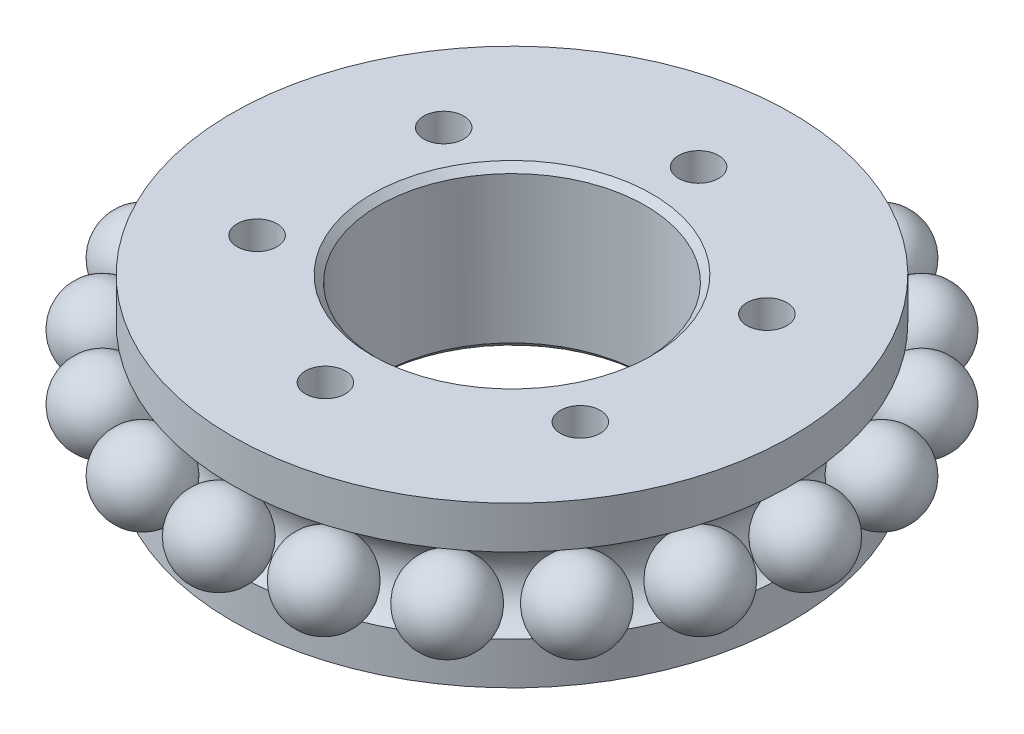
ISO-10303-21;
HEADER;
FILE_DESCRIPTION(('STEP AP214'),'2;1');
FILE_NAME('part.step','',(''),(''),'','','');
FILE_SCHEMA(('AUTOMOTIVE_DESIGN { 1 0 10303 214 1 1 1 1 }'));
ENDSEC;
DATA;
#1=APPLICATION_CONTEXT('core data for automotive mechanical design processes');
#2=APPLICATION_PROTOCOL_DEFINITION('international standard','automotive_design',2000,#1);
#3=PRODUCT_CONTEXT('',#1,'mechanical');
#4=PRODUCT('Part','Part','',(#3));
#5=PRODUCT_RELATED_PRODUCT_CATEGORY('part','',(#4));
#6=PRODUCT_DEFINITION_FORMATION('','',#4);
#7=PRODUCT_DEFINITION_CONTEXT('part definition',#1,'design');
#8=PRODUCT_DEFINITION('design','',#6,#7);
#9=PRODUCT_DEFINITION_SHAPE('','',#8);
#10=(LENGTH_UNIT() NAMED_UNIT(*) SI_UNIT(.MILLI.,.METRE.));
#11=(NAMED_UNIT(*) PLANE_ANGLE_UNIT() SI_UNIT($,.RADIAN.));
#12=(NAMED_UNIT(*) SI_UNIT($,.STERADIAN.) SOLID_ANGLE_UNIT());
#13=UNCERTAINTY_MEASURE_WITH_UNIT(LENGTH_MEASURE(1.E-05),#10,'distance_accuracy_value','');
#14=(GEOMETRIC_REPRESENTATION_CONTEXT(3) GLOBAL_UNCERTAINTY_ASSIGNED_CONTEXT((#13)) GLOBAL_UNIT_ASSIGNED_CONTEXT((#10,
#11,#12)) REPRESENTATION_CONTEXT('',''));
#15=CARTESIAN_POINT('',(0.,0.,0.));
#16=DIRECTION('',(0.,0.,1.));
#17=DIRECTION('',(1.,0.,0.));
#18=AXIS2_PLACEMENT_3D('',#15,#16,#17);
#19=CARTESIAN_POINT('',(-6.79837387624859,0.,20.9232433584935));
#20=DIRECTION('',(0.,1.,0.));
#21=DIRECTION('',(0.309016994374936,0.,-0.951056516295158));
#22=AXIS2_PLACEMENT_3D('',#19,#20,#21);
#23=SPHERICAL_SURFACE('',#22,3.);
#24=CARTESIAN_POINT('',(-6.79837387624859,3.,20.9232433584935));
#25=VERTEX_POINT('',#24);
#26=VERTEX_LOOP('',#25);
#27=FACE_BOUND('',#26,.T.);
#28=ADVANCED_FACE('F39',(#27),#23,.T.);
#29=CLOSED_SHELL('',(#28));
#30=MANIFOLD_SOLID_BREP('B2',#29);
#31=CARTESIAN_POINT('',(-12.9312755504342,0.,17.798373876249));
#32=DIRECTION('',(0.,1.,0.));
#33=DIRECTION('',(0.587785252292463,0.,-0.809016994374955));
#34=AXIS2_PLACEMENT_3D('',#31,#32,#33);
#35=SPHERICAL_SURFACE('',#34,3.);
#36=CARTESIAN_POINT('',(-12.9312755504342,3.,17.798373876249));
#37=VERTEX_POINT('',#36);
#38=VERTEX_LOOP('',#37);
#39=FACE_BOUND('',#38,.T.);
#40=ADVANCED_FACE('F59',(#39),#35,.T.);
#41=CLOSED_SHELL('',(#40));
#42=MANIFOLD_SOLID_BREP('B6',#41);
#43=CARTESIAN_POINT('',(-17.7983738762487,0.,12.9312755504346));
#44=DIRECTION('',(0.,1.,0.));
#45=DIRECTION('',(0.809016994374941,0.,-0.587785252292482));
#46=AXIS2_PLACEMENT_3D('',#43,#44,#45);
#47=SPHERICAL_SURFACE('',#46,3.);
#48=CARTESIAN_POINT('',(-17.7983738762487,3.,12.9312755504346));
#49=VERTEX_POINT('',#48);
#50=VERTEX_LOOP('',#49);
#51=FACE_BOUND('',#50,.T.);
#52=ADVANCED_FACE('F79',(#51),#47,.T.);
#53=CLOSED_SHELL('',(#52));
#54=MANIFOLD_SOLID_BREP('B35',#53);
#55=CARTESIAN_POINT('',(-20.9232433584933,0.,6.79837387624906));
#56=DIRECTION('',(0.,1.,0.));
#57=DIRECTION('',(0.95105651629515,0.,-0.309016994374957));
#58=AXIS2_PLACEMENT_3D('',#55,#56,#57);
#59=SPHERICAL_SURFACE('',#58,3.);
#60=CARTESIAN_POINT('',(-20.9232433584933,3.,6.79837387624906));
#61=VERTEX_POINT('',#60);
#62=VERTEX_LOOP('',#61);
#63=FACE_BOUND('',#62,.T.);
#64=ADVANCED_FACE('F99',(#63),#59,.T.);
#65=CLOSED_SHELL('',(#64));
#66=MANIFOLD_SOLID_BREP('B55',#65);
#67=CARTESIAN_POINT('',(-22.,0.,2.10897843130244E-13));
#68=DIRECTION('',(0.,1.,0.));
#69=DIRECTION('',(1.,0.,0.));
#70=AXIS2_PLACEMENT_3D('',#67,#68,#69);
#71=SPHERICAL_SURFACE('',#70,3.);
#72=CARTESIAN_POINT('',(-22.,3.,2.10897843130244E-13));
#73=VERTEX_POINT('',#72);
#74=VERTEX_LOOP('',#73);
#75=FACE_BOUND('',#74,.T.);
#76=ADVANCED_FACE('F119',(#75),#71,.T.);
#77=CLOSED_SHELL('',(#76));
#78=MANIFOLD_SOLID_BREP('B75',#77);
#79=CARTESIAN_POINT('',(-20.9232433584934,0.,-6.79837387624866));
#80=DIRECTION('',(0.,1.,0.));
#81=DIRECTION('',(0.951056516295156,0.,0.309016994374939));
#82=AXIS2_PLACEMENT_3D('',#79,#80,#81);
#83=SPHERICAL_SURFACE('',#82,3.);
#84=CARTESIAN_POINT('',(-20.9232433584934,3.,-6.79837387624866));
#85=VERTEX_POINT('',#84);
#86=VERTEX_LOOP('',#85);
#87=FACE_BOUND('',#86,.T.);
#88=ADVANCED_FACE('F139',(#87),#83,.T.);
#89=CLOSED_SHELL('',(#88));
#90=MANIFOLD_SOLID_BREP('B95',#89);
#91=CARTESIAN_POINT('',(-17.798373876249,0.,-12.9312755504343));
#92=DIRECTION('',(0.,1.,0.));
#93=DIRECTION('',(0.809016994374953,0.,0.587785252292466));
#94=AXIS2_PLACEMENT_3D('',#91,#92,#93);
#95=SPHERICAL_SURFACE('',#94,3.);
#96=CARTESIAN_POINT('',(-17.798373876249,3.,-12.9312755504343));
#97=VERTEX_POINT('',#96);
#98=VERTEX_LOOP('',#97);
#99=FACE_BOUND('',#98,.T.);
#100=ADVANCED_FACE('F159',(#99),#95,.T.);
#101=CLOSED_SHELL('',(#100));
#102=MANIFOLD_SOLID_BREP('B115',#101);
#103=CARTESIAN_POINT('',(-12.9312755504345,0.,-17.7983738762487));
#104=DIRECTION('',(0.,1.,0.));
#105=DIRECTION('',(0.58778525229248,0.,0.809016994374943));
#106=AXIS2_PLACEMENT_3D('',#103,#104,#105);
#107=SPHERICAL_SURFACE('',#106,3.);
#108=CARTESIAN_POINT('',(-12.9312755504345,3.,-17.7983738762487));
#109=VERTEX_POINT('',#108);
#110=VERTEX_LOOP('',#109);
#111=FACE_BOUND('',#110,.T.);
#112=ADVANCED_FACE('F179',(#111),#107,.T.);
#113=CLOSED_SHELL('',(#112));
#114=MANIFOLD_SOLID_BREP('B135',#113);
#115=CARTESIAN_POINT('',(-6.79837387624899,0.,-20.9232433584933));
#116=DIRECTION('',(0.,1.,0.));
#117=DIRECTION('',(0.309016994374954,0.,0.951056516295151));
#118=AXIS2_PLACEMENT_3D('',#115,#116,#117);
#119=SPHERICAL_SURFACE('',#118,3.);
#120=CARTESIAN_POINT('',(-6.79837387624899,3.,-20.9232433584933));
#121=VERTEX_POINT('',#120);
#122=VERTEX_LOOP('',#121);
#123=FACE_BOUND('',#122,.T.);
#124=ADVANCED_FACE('F199',(#123),#119,.T.);
#125=CLOSED_SHELL('',(#124));
#126=MANIFOLD_SOLID_BREP('B155',#125);
#127=CARTESIAN_POINT('',(-1.43855216292396E-13,0.,-22.));
#128=DIRECTION('',(0.,1.,0.));
#129=DIRECTION('',(0.,0.,1.));
#130=AXIS2_PLACEMENT_3D('',#127,#128,#129);
#131=SPHERICAL_SURFACE('',#130,3.);
#132=CARTESIAN_POINT('',(-1.43855216292396E-13,3.,-22.));
#133=VERTEX_POINT('',#132);
#134=VERTEX_LOOP('',#133);
#135=FACE_BOUND('',#134,.T.);
#136=ADVANCED_FACE('F219',(#135),#131,.T.);
#137=CLOSED_SHELL('',(#136));
#138=MANIFOLD_SOLID_BREP('B175',#137);
#139=CARTESIAN_POINT('',(6.79837387624872,0.,-20.9232433584934));
#140=DIRECTION('',(0.,1.,0.));
#141=DIRECTION('',(-0.309016994374942,0.,0.951056516295155));
#142=AXIS2_PLACEMENT_3D('',#139,#140,#141);
#143=SPHERICAL_SURFACE('',#142,3.);
#144=CARTESIAN_POINT('',(6.79837387624872,3.,-20.9232433584934));
#145=VERTEX_POINT('',#144);
#146=VERTEX_LOOP('',#145);
#147=FACE_BOUND('',#146,.T.);
#148=ADVANCED_FACE('F239',(#147),#143,.T.);
#149=CLOSED_SHELL('',(#148));
#150=MANIFOLD_SOLID_BREP('B195',#149);
#151=CARTESIAN_POINT('',(12.9312755504343,0.,-17.7983738762489));
#152=DIRECTION('',(0.,1.,0.));
#153=DIRECTION('',(-0.587785252292469,0.,0.80901699437495));
#154=AXIS2_PLACEMENT_3D('',#151,#152,#153);
#155=SPHERICAL_SURFACE('',#154,3.);
#156=CARTESIAN_POINT('',(12.9312755504343,3.,-17.7983738762489));
#157=VERTEX_POINT('',#156);
#158=VERTEX_LOOP('',#157);
#159=FACE_BOUND('',#158,.T.);
#160=ADVANCED_FACE('F259',(#159),#155,.T.);
#161=CLOSED_SHELL('',(#160));
#162=MANIFOLD_SOLID_BREP('B215',#161);
#163=CARTESIAN_POINT('',(17.7983738762488,0.,-12.9312755504345));
#164=DIRECTION('',(0.,1.,0.));
#165=DIRECTION('',(-0.809016994374945,0.,0.587785252292477));
#166=AXIS2_PLACEMENT_3D('',#163,#164,#165);
#167=SPHERICAL_SURFACE('',#166,3.);
#168=CARTESIAN_POINT('',(17.7983738762488,3.,-12.9312755504345));
#169=VERTEX_POINT('',#168);
#170=VERTEX_LOOP('',#169);
#171=FACE_BOUND('',#170,.T.);
#172=ADVANCED_FACE('F279',(#171),#167,.T.);
#173=CLOSED_SHELL('',(#172));
#174=MANIFOLD_SOLID_BREP('B235',#173);
#175=CARTESIAN_POINT('',(20.9232433584934,0.,-6.79837387624893));
#176=DIRECTION('',(0.,1.,0.));
#177=DIRECTION('',(-0.951056516295153,0.,0.309016994374951));
#178=AXIS2_PLACEMENT_3D('',#175,#176,#177);
#179=SPHERICAL_SURFACE('',#178,3.);
#180=CARTESIAN_POINT('',(20.9232433584934,3.,-6.79837387624893));
#181=VERTEX_POINT('',#180);
#182=VERTEX_LOOP('',#181);
#183=FACE_BOUND('',#182,.T.);
#184=ADVANCED_FACE('F299',(#183),#179,.T.);
#185=CLOSED_SHELL('',(#184));
#186=MANIFOLD_SOLID_BREP('B255',#185);
#187=CARTESIAN_POINT('',(22.,0.,0.));
#188=DIRECTION('',(0.,1.,0.));
#189=DIRECTION('',(-1.,0.,0.));
#190=AXIS2_PLACEMENT_3D('',#187,#188,#189);
#191=SPHERICAL_SURFACE('',#190,3.);
#192=CARTESIAN_POINT('',(22.,3.,0.));
#193=VERTEX_POINT('',#192);
#194=VERTEX_LOOP('',#193);
#195=FACE_BOUND('',#194,.T.);
#196=ADVANCED_FACE('F319',(#195),#191,.T.);
#197=CLOSED_SHELL('',(#196));
#198=MANIFOLD_SOLID_BREP('B275',#197);
#199=CARTESIAN_POINT('',(20.9232433584934,0.,6.79837387624879));
#200=DIRECTION('',(0.,1.,0.));
#201=DIRECTION('',(-0.951056516295154,0.,-0.309016994374945));
#202=AXIS2_PLACEMENT_3D('',#199,#200,#201);
#203=SPHERICAL_SURFACE('',#202,3.);
#204=CARTESIAN_POINT('',(20.9232433584934,3.,6.79837387624879));
#205=VERTEX_POINT('',#204);
#206=VERTEX_LOOP('',#205);
#207=FACE_BOUND('',#206,.T.);
#208=ADVANCED_FACE('F339',(#207),#203,.T.);
#209=CLOSED_SHELL('',(#208));
#210=MANIFOLD_SOLID_BREP('B295',#209);
#211=CARTESIAN_POINT('',(17.7983738762489,0.,12.9312755504344));
#212=DIRECTION('',(0.,1.,0.));
#213=DIRECTION('',(-0.809016994374949,0.,-0.587785252292472));
#214=AXIS2_PLACEMENT_3D('',#211,#212,#213);
#215=SPHERICAL_SURFACE('',#214,3.);
#216=CARTESIAN_POINT('',(17.7983738762489,3.,12.9312755504344));
#217=VERTEX_POINT('',#216);
#218=VERTEX_LOOP('',#217);
#219=FACE_BOUND('',#218,.T.);
#220=ADVANCED_FACE('F359',(#219),#215,.T.);
#221=CLOSED_SHELL('',(#220));
#222=MANIFOLD_SOLID_BREP('B315',#221);
#223=CARTESIAN_POINT('',(12.9312755504344,0.,17.7983738762488));
#224=DIRECTION('',(0.,1.,0.));
#225=DIRECTION('',(-0.587785252292474,0.,-0.809016994374947));
#226=AXIS2_PLACEMENT_3D('',#223,#224,#225);
#227=SPHERICAL_SURFACE('',#226,3.);
#228=CARTESIAN_POINT('',(12.9312755504344,3.,17.7983738762488));
#229=VERTEX_POINT('',#228);
#230=VERTEX_LOOP('',#229);
#231=FACE_BOUND('',#230,.T.);
#232=ADVANCED_FACE('F379',(#231),#227,.T.);
#233=CLOSED_SHELL('',(#232));
#234=MANIFOLD_SOLID_BREP('B335',#233);
#235=CARTESIAN_POINT('',(6.79837387624886,0.,20.9232433584934));
#236=DIRECTION('',(0.,1.,0.));
#237=DIRECTION('',(-0.309016994374948,0.,-0.951056516295153));
#238=AXIS2_PLACEMENT_3D('',#235,#236,#237);
#239=SPHERICAL_SURFACE('',#238,3.);
#240=CARTESIAN_POINT('',(6.79837387624886,3.,20.9232433584934));
#241=VERTEX_POINT('',#240);
#242=VERTEX_LOOP('',#241);
#243=FACE_BOUND('',#242,.T.);
#244=ADVANCED_FACE('F399',(#243),#239,.T.);
#245=CLOSED_SHELL('',(#244));
#246=MANIFOLD_SOLID_BREP('B355',#245);
#247=CARTESIAN_POINT('',(0.,0.,22.));
#248=DIRECTION('',(0.,1.,0.));
#249=DIRECTION('',(0.,0.,-1.));
#250=AXIS2_PLACEMENT_3D('',#247,#248,#249);
#251=SPHERICAL_SURFACE('',#250,3.);
#252=CARTESIAN_POINT('',(0.,3.,22.));
#253=VERTEX_POINT('',#252);
#254=VERTEX_LOOP('',#253);
#255=FACE_BOUND('',#254,.T.);
#256=ADVANCED_FACE('F420',(#255),#251,.T.);
#257=CLOSED_SHELL('',(#256));
#258=MANIFOLD_SOLID_BREP('B375',#257);
#259=CARTESIAN_POINT('',(-9.99999999999999,6.,0.));
#260=DIRECTION('',(0.,1.,0.));
#261=DIRECTION('',(0.,0.,1.));
#262=AXIS2_PLACEMENT_3D('',#259,#260,#261);
#263=PLANE('',#262);
#264=CARTESIAN_POINT('',(0.,6.,0.));
#265=DIRECTION('',(0.,1.,0.));
#266=DIRECTION('',(0.,0.,1.));
#267=AXIS2_PLACEMENT_3D('',#264,#265,#266);
#268=CIRCLE('',#267,10.5);
#269=CARTESIAN_POINT('',(0.,6.,10.5));
#270=VERTEX_POINT('',#269);
#271=EDGE_CURVE('E419',#270,#270,#268,.F.);
#272=ORIENTED_EDGE('',*,*,#271,.T.);
#273=EDGE_LOOP('',(#272));
#274=FACE_BOUND('',#273,.T.);
#275=CARTESIAN_POINT('',(12.1243556529823,6.,-7.00000000000035));
#276=DIRECTION('',(0.,1.,0.));
#277=DIRECTION('',(0.,0.,1.));
#278=AXIS2_PLACEMENT_3D('',#275,#276,#277);
#279=CIRCLE('',#278,1.50000000000012);
#280=CARTESIAN_POINT('',(12.1243556529823,6.,-5.50000000000022));
#281=VERTEX_POINT('',#280);
#282=EDGE_CURVE('E469',#281,#281,#279,.T.);
#283=ORIENTED_EDGE('',*,*,#282,.F.);
#284=EDGE_LOOP('',(#283));
#285=FACE_BOUND('',#284,.T.);
#286=CARTESIAN_POINT('',(12.1243556529827,6.,6.99999999999965));
#287=DIRECTION('',(0.,1.,0.));
#288=DIRECTION('',(0.,0.,1.));
#289=AXIS2_PLACEMENT_3D('',#286,#287,#288);
#290=CIRCLE('',#289,1.50000000000053);
#291=CARTESIAN_POINT('',(12.1243556529827,6.,8.50000000000019));
#292=VERTEX_POINT('',#291);
#293=EDGE_CURVE('E495',#292,#292,#290,.T.);
#294=ORIENTED_EDGE('',*,*,#293,.F.);
#295=EDGE_LOOP('',(#294));
#296=FACE_BOUND('',#295,.T.);
#297=CARTESIAN_POINT('',(7.923788530137E-13,6.,14.));
#298=DIRECTION('',(0.,1.,0.));
#299=DIRECTION('',(0.,0.,1.));
#300=AXIS2_PLACEMENT_3D('',#297,#298,#299);
#301=CIRCLE('',#300,1.50000000000085);
#302=CARTESIAN_POINT('',(7.923788530137E-13,6.,15.5000000000009));
#303=VERTEX_POINT('',#302);
#304=EDGE_CURVE('E492',#303,#303,#301,.T.);
#305=ORIENTED_EDGE('',*,*,#304,.F.);
#306=EDGE_LOOP('',(#305));
#307=FACE_BOUND('',#306,.T.);
#308=CARTESIAN_POINT('',(-12.1243556529815,6.,7.00000000000035));
#309=DIRECTION('',(0.,1.,0.));
#310=DIRECTION('',(0.,0.,1.));
#311=AXIS2_PLACEMENT_3D('',#308,#309,#310);
#312=CIRCLE('',#311,1.5000000000008);
#313=CARTESIAN_POINT('',(-12.1243556529815,6.,8.50000000000115));
#314=VERTEX_POINT('',#313);
#315=EDGE_CURVE('E489',#314,#314,#312,.T.);
#316=ORIENTED_EDGE('',*,*,#315,.F.);
#317=EDGE_LOOP('',(#316));
#318=FACE_BOUND('',#317,.T.);
#319=CARTESIAN_POINT('',(-12.1243556529819,6.,-6.99999999999965));
#320=DIRECTION('',(0.,1.,0.));
#321=DIRECTION('',(0.,0.,1.));
#322=AXIS2_PLACEMENT_3D('',#319,#320,#321);
#323=CIRCLE('',#322,1.50000000000046);
#324=CARTESIAN_POINT('',(-12.1243556529819,6.,-5.49999999999919));
#325=VERTEX_POINT('',#324);
#326=EDGE_CURVE('E486',#325,#325,#323,.T.);
#327=ORIENTED_EDGE('',*,*,#326,.F.);
#328=EDGE_LOOP('',(#327));
#329=FACE_BOUND('',#328,.T.);
#330=CARTESIAN_POINT('',(0.,6.,-14.));
#331=DIRECTION('',(0.,1.,0.));
#332=DIRECTION('',(0.,0.,1.));
#333=AXIS2_PLACEMENT_3D('',#330,#331,#332);
#334=CIRCLE('',#333,1.5);
#335=CARTESIAN_POINT('',(0.,6.,-12.5));
#336=VERTEX_POINT('',#335);
#337=EDGE_CURVE('E456',#336,#336,#334,.T.);
#338=ORIENTED_EDGE('',*,*,#337,.F.);
#339=EDGE_LOOP('',(#338));
#340=FACE_BOUND('',#339,.T.);
#341=CARTESIAN_POINT('',(0.,6.,0.));
#342=DIRECTION('',(0.,1.,0.));
#343=DIRECTION('',(0.,0.,1.));
#344=AXIS2_PLACEMENT_3D('',#341,#342,#343);
#345=CIRCLE('',#344,21.);
#346=CARTESIAN_POINT('',(0.,6.,21.));
#347=VERTEX_POINT('',#346);
#348=EDGE_CURVE('E473',#347,#347,#345,.T.);
#349=ORIENTED_EDGE('',*,*,#348,.T.);
#350=EDGE_LOOP('',(#349));
#351=FACE_BOUND('',#350,.T.);
#352=ADVANCED_FACE('F432',(#274,#285,#296,#307,#318,#329,#340,#351),#263,.T.);
#353=CARTESIAN_POINT('',(0.,41.0991264481202,0.));
#354=DIRECTION('',(0.,1.,0.));
#355=DIRECTION('',(0.,0.,1.));
#356=AXIS2_PLACEMENT_3D('',#353,#354,#355);
#357=CYLINDRICAL_SURFACE('',#356,9.99999999999999);
#358=CARTESIAN_POINT('',(0.,-5.5,0.));
#359=DIRECTION('',(0.,-1.,0.));
#360=DIRECTION('',(0.,0.,-1.));
#361=AXIS2_PLACEMENT_3D('',#358,#359,#360);
#362=CIRCLE('',#361,9.99999999999999);
#363=CARTESIAN_POINT('',(0.,-5.5,-9.99999999999999));
#364=VERTEX_POINT('',#363);
#365=EDGE_CURVE('E439',#364,#364,#362,.T.);
#366=ORIENTED_EDGE('',*,*,#365,.T.);
#367=EDGE_LOOP('',(#366));
#368=FACE_BOUND('',#367,.T.);
#369=CARTESIAN_POINT('',(0.,5.5,0.));
#370=DIRECTION('',(0.,1.,0.));
#371=DIRECTION('',(0.,0.,1.));
#372=AXIS2_PLACEMENT_3D('',#369,#370,#371);
#373=CIRCLE('',#372,9.99999999999999);
#374=CARTESIAN_POINT('',(0.,5.5,9.99999999999999));
#375=VERTEX_POINT('',#374);
#376=EDGE_CURVE('E443',#375,#375,#373,.T.);
#377=ORIENTED_EDGE('',*,*,#376,.T.);
#378=EDGE_LOOP('',(#377));
#379=FACE_BOUND('',#378,.T.);
#380=ADVANCED_FACE('F505',(#368,#379),#357,.F.);
#381=CARTESIAN_POINT('',(-9.99999999999999,-6.,0.));
#382=DIRECTION('',(0.,-1.,0.));
#383=DIRECTION('',(0.,0.,-1.));
#384=AXIS2_PLACEMENT_3D('',#381,#382,#383);
#385=PLANE('',#384);
#386=CARTESIAN_POINT('',(0.,-6.,0.));
#387=DIRECTION('',(0.,-1.,0.));
#388=DIRECTION('',(0.,0.,-1.));
#389=AXIS2_PLACEMENT_3D('',#386,#387,#388);
#390=CIRCLE('',#389,10.5);
#391=CARTESIAN_POINT('',(0.,-6.,-10.5));
#392=VERTEX_POINT('',#391);
#393=EDGE_CURVE('E447',#392,#392,#390,.F.);
#394=ORIENTED_EDGE('',*,*,#393,.T.);
#395=EDGE_LOOP('',(#394));
#396=FACE_BOUND('',#395,.T.);
#397=CARTESIAN_POINT('',(12.1243556529823,-6.,-7.00000000000035));
#398=DIRECTION('',(0.,-1.,0.));
#399=DIRECTION('',(0.,0.,-1.));
#400=AXIS2_PLACEMENT_3D('',#397,#398,#399);
#401=CIRCLE('',#400,1.50000000000012);
#402=CARTESIAN_POINT('',(12.1243556529823,-6.,-8.50000000000047));
#403=VERTEX_POINT('',#402);
#404=EDGE_CURVE('E453',#403,#403,#401,.T.);
#405=ORIENTED_EDGE('',*,*,#404,.F.);
#406=EDGE_LOOP('',(#405));
#407=FACE_BOUND('',#406,.T.);
#408=CARTESIAN_POINT('',(12.1243556529827,-6.,6.99999999999965));
#409=DIRECTION('',(0.,-1.,0.));
#410=DIRECTION('',(0.,0.,-1.));
#411=AXIS2_PLACEMENT_3D('',#408,#409,#410);
#412=CIRCLE('',#411,1.50000000000053);
#413=CARTESIAN_POINT('',(12.1243556529827,-6.,5.49999999999912));
#414=VERTEX_POINT('',#413);
#415=EDGE_CURVE('E457',#414,#414,#412,.T.);
#416=ORIENTED_EDGE('',*,*,#415,.F.);
#417=EDGE_LOOP('',(#416));
#418=FACE_BOUND('',#417,.T.);
#419=CARTESIAN_POINT('',(7.923788530137E-13,-6.,14.));
#420=DIRECTION('',(0.,-1.,0.));
#421=DIRECTION('',(0.,0.,-1.));
#422=AXIS2_PLACEMENT_3D('',#419,#420,#421);
#423=CIRCLE('',#422,1.50000000000085);
#424=CARTESIAN_POINT('',(7.923788530137E-13,-6.,12.4999999999991));
#425=VERTEX_POINT('',#424);
#426=EDGE_CURVE('E460',#425,#425,#423,.T.);
#427=ORIENTED_EDGE('',*,*,#426,.F.);
#428=EDGE_LOOP('',(#427));
#429=FACE_BOUND('',#428,.T.);
#430=CARTESIAN_POINT('',(-12.1243556529815,-6.,7.00000000000035));
#431=DIRECTION('',(0.,-1.,0.));
#432=DIRECTION('',(0.,0.,-1.));
#433=AXIS2_PLACEMENT_3D('',#430,#431,#432);
#434=CIRCLE('',#433,1.5000000000008);
#435=CARTESIAN_POINT('',(-12.1243556529815,-6.,5.49999999999955));
#436=VERTEX_POINT('',#435);
#437=EDGE_CURVE('E463',#436,#436,#434,.T.);
#438=ORIENTED_EDGE('',*,*,#437,.F.);
#439=EDGE_LOOP('',(#438));
#440=FACE_BOUND('',#439,.T.);
#441=CARTESIAN_POINT('',(-12.1243556529819,-6.,-6.99999999999965));
#442=DIRECTION('',(0.,-1.,0.));
#443=DIRECTION('',(0.,0.,-1.));
#444=AXIS2_PLACEMENT_3D('',#441,#442,#443);
#445=CIRCLE('',#444,1.50000000000046);
#446=CARTESIAN_POINT('',(-12.1243556529819,-6.,-8.5000000000001));
#447=VERTEX_POINT('',#446);
#448=EDGE_CURVE('E466',#447,#447,#445,.T.);
#449=ORIENTED_EDGE('',*,*,#448,.F.);
#450=EDGE_LOOP('',(#449));
#451=FACE_BOUND('',#450,.T.);
#452=CARTESIAN_POINT('',(0.,-6.,-14.));
#453=DIRECTION('',(0.,-1.,0.));
#454=DIRECTION('',(0.,0.,-1.));
#455=AXIS2_PLACEMENT_3D('',#452,#453,#454);
#456=CIRCLE('',#455,1.5);
#457=CARTESIAN_POINT('',(0.,-6.,-15.5));
#458=VERTEX_POINT('',#457);
#459=EDGE_CURVE('E470',#458,#458,#456,.T.);
#460=ORIENTED_EDGE('',*,*,#459,.F.);
#461=EDGE_LOOP('',(#460));
#462=FACE_BOUND('',#461,.T.);
#463=CARTESIAN_POINT('',(0.,-6.,0.));
#464=DIRECTION('',(0.,1.,0.));
#465=DIRECTION('',(0.,0.,1.));
#466=AXIS2_PLACEMENT_3D('',#463,#464,#465);
#467=CIRCLE('',#466,21.);
#468=CARTESIAN_POINT('',(0.,-6.,21.));
#469=VERTEX_POINT('',#468);
#470=EDGE_CURVE('E452',#469,#469,#467,.T.);
#471=ORIENTED_EDGE('',*,*,#470,.F.);
#472=EDGE_LOOP('',(#471));
#473=FACE_BOUND('',#472,.T.);
#474=ADVANCED_FACE('F539',(#396,#407,#418,#429,#440,#451,#462,#473),#385,.T.);
#475=CARTESIAN_POINT('',(0.,41.0991264481202,0.));
#476=DIRECTION('',(0.,1.,0.));
#477=DIRECTION('',(0.,0.,1.));
#478=AXIS2_PLACEMENT_3D('',#475,#476,#477);
#479=CYLINDRICAL_SURFACE('',#478,21.);
#480=ORIENTED_EDGE('',*,*,#470,.T.);
#481=EDGE_LOOP('',(#480));
#482=FACE_BOUND('',#481,.T.);
#483=CARTESIAN_POINT('',(0.,-2.82842712474619,0.));
#484=DIRECTION('',(0.,1.,0.));
#485=DIRECTION('',(0.,0.,1.));
#486=AXIS2_PLACEMENT_3D('',#483,#484,#485);
#487=CIRCLE('',#486,21.);
#488=CARTESIAN_POINT('',(0.,-2.82842712474619,21.));
#489=VERTEX_POINT('',#488);
#490=EDGE_CURVE('E476',#489,#489,#487,.T.);
#491=ORIENTED_EDGE('',*,*,#490,.F.);
#492=EDGE_LOOP('',(#491));
#493=FACE_BOUND('',#492,.T.);
#494=ADVANCED_FACE('F532',(#482,#493),#479,.T.);
#495=CARTESIAN_POINT('',(0.,0.,0.));
#496=DIRECTION('',(0.,1.,0.));
#497=DIRECTION('',(0.,0.,1.));
#498=AXIS2_PLACEMENT_3D('',#495,#496,#497);
#499=TOROIDAL_SURFACE('',#498,22.,3.);
#500=ORIENTED_EDGE('',*,*,#490,.T.);
#501=EDGE_LOOP('',(#500));
#502=FACE_BOUND('',#501,.T.);
#503=CARTESIAN_POINT('',(0.,2.82842712474619,0.));
#504=DIRECTION('',(0.,1.,0.));
#505=DIRECTION('',(0.,0.,1.));
#506=AXIS2_PLACEMENT_3D('',#503,#504,#505);
#507=CIRCLE('',#506,21.);
#508=CARTESIAN_POINT('',(0.,2.82842712474619,21.));
#509=VERTEX_POINT('',#508);
#510=EDGE_CURVE('E479',#509,#509,#507,.T.);
#511=ORIENTED_EDGE('',*,*,#510,.F.);
#512=EDGE_LOOP('',(#511));
#513=FACE_BOUND('',#512,.T.);
#514=ADVANCED_FACE('F522',(#502,#513),#499,.F.);
#515=CARTESIAN_POINT('',(0.,41.0991264481202,0.));
#516=DIRECTION('',(0.,1.,0.));
#517=DIRECTION('',(0.,0.,1.));
#518=AXIS2_PLACEMENT_3D('',#515,#516,#517);
#519=CYLINDRICAL_SURFACE('',#518,21.);
#520=ORIENTED_EDGE('',*,*,#510,.T.);
#521=EDGE_LOOP('',(#520));
#522=FACE_BOUND('',#521,.T.);
#523=ORIENTED_EDGE('',*,*,#348,.F.);
#524=EDGE_LOOP('',(#523));
#525=FACE_BOUND('',#524,.T.);
#526=ADVANCED_FACE('F519',(#522,#525),#519,.T.);
#527=CARTESIAN_POINT('',(0.,-14.,-14.));
#528=DIRECTION('',(0.,1.,0.));
#529=DIRECTION('',(0.,0.,1.));
#530=AXIS2_PLACEMENT_3D('',#527,#528,#529);
#531=CYLINDRICAL_SURFACE('',#530,1.5);
#532=ORIENTED_EDGE('',*,*,#459,.T.);
#533=EDGE_LOOP('',(#532));
#534=FACE_BOUND('',#533,.T.);
#535=ORIENTED_EDGE('',*,*,#337,.T.);
#536=EDGE_LOOP('',(#535));
#537=FACE_BOUND('',#536,.T.);
#538=ADVANCED_FACE('F521',(#534,#537),#531,.F.);
#539=CARTESIAN_POINT('',(-12.1243556529819,-14.,-6.99999999999965));
#540=DIRECTION('',(0.,1.,0.));
#541=DIRECTION('',(0.,0.,1.));
#542=AXIS2_PLACEMENT_3D('',#539,#540,#541);
#543=CYLINDRICAL_SURFACE('',#542,1.50000000000046);
#544=ORIENTED_EDGE('',*,*,#448,.T.);
#545=EDGE_LOOP('',(#544));
#546=FACE_BOUND('',#545,.T.);
#547=ORIENTED_EDGE('',*,*,#326,.T.);
#548=EDGE_LOOP('',(#547));
#549=FACE_BOUND('',#548,.T.);
#550=ADVANCED_FACE('F529',(#546,#549),#543,.F.);
#551=CARTESIAN_POINT('',(-12.1243556529815,-14.,7.00000000000035));
#552=DIRECTION('',(0.,1.,0.));
#553=DIRECTION('',(0.,0.,1.));
#554=AXIS2_PLACEMENT_3D('',#551,#552,#553);
#555=CYLINDRICAL_SURFACE('',#554,1.5000000000008);
#556=ORIENTED_EDGE('',*,*,#437,.T.);
#557=EDGE_LOOP('',(#556));
#558=FACE_BOUND('',#557,.T.);
#559=ORIENTED_EDGE('',*,*,#315,.T.);
#560=EDGE_LOOP('',(#559));
#561=FACE_BOUND('',#560,.T.);
#562=ADVANCED_FACE('F580',(#558,#561),#555,.F.);
#563=CARTESIAN_POINT('',(7.923788530137E-13,-14.,14.));
#564=DIRECTION('',(0.,1.,0.));
#565=DIRECTION('',(0.,0.,1.));
#566=AXIS2_PLACEMENT_3D('',#563,#564,#565);
#567=CYLINDRICAL_SURFACE('',#566,1.50000000000085);
#568=ORIENTED_EDGE('',*,*,#426,.T.);
#569=EDGE_LOOP('',(#568));
#570=FACE_BOUND('',#569,.T.);
#571=ORIENTED_EDGE('',*,*,#304,.T.);
#572=EDGE_LOOP('',(#571));
#573=FACE_BOUND('',#572,.T.);
#574=ADVANCED_FACE('F584',(#570,#573),#567,.F.);
#575=CARTESIAN_POINT('',(12.1243556529827,-14.,6.99999999999965));
#576=DIRECTION('',(0.,1.,0.));
#577=DIRECTION('',(0.,0.,1.));
#578=AXIS2_PLACEMENT_3D('',#575,#576,#577);
#579=CYLINDRICAL_SURFACE('',#578,1.50000000000053);
#580=ORIENTED_EDGE('',*,*,#415,.T.);
#581=EDGE_LOOP('',(#580));
#582=FACE_BOUND('',#581,.T.);
#583=ORIENTED_EDGE('',*,*,#293,.T.);
#584=EDGE_LOOP('',(#583));
#585=FACE_BOUND('',#584,.T.);
#586=ADVANCED_FACE('F553',(#582,#585),#579,.F.);
#587=CARTESIAN_POINT('',(12.1243556529823,-14.,-7.00000000000035));
#588=DIRECTION('',(0.,1.,0.));
#589=DIRECTION('',(0.,0.,1.));
#590=AXIS2_PLACEMENT_3D('',#587,#588,#589);
#591=CYLINDRICAL_SURFACE('',#590,1.50000000000012);
#592=ORIENTED_EDGE('',*,*,#404,.T.);
#593=EDGE_LOOP('',(#592));
#594=FACE_BOUND('',#593,.T.);
#595=ORIENTED_EDGE('',*,*,#282,.T.);
#596=EDGE_LOOP('',(#595));
#597=FACE_BOUND('',#596,.T.);
#598=ADVANCED_FACE('F501',(#594,#597),#591,.F.);
#599=CARTESIAN_POINT('',(0.,-6.,0.));
#600=DIRECTION('',(0.,-1.,0.));
#601=DIRECTION('',(0.,0.,-1.));
#602=AXIS2_PLACEMENT_3D('',#599,#600,#601);
#603=CONICAL_SURFACE('',#602,10.5,0.785398163397448);
#604=ORIENTED_EDGE('',*,*,#365,.F.);
#605=EDGE_LOOP('',(#604));
#606=FACE_BOUND('',#605,.T.);
#607=ORIENTED_EDGE('',*,*,#393,.F.);
#608=EDGE_LOOP('',(#607));
#609=FACE_BOUND('',#608,.T.);
#610=ADVANCED_FACE('F545',(#606,#609),#603,.F.);
#611=CARTESIAN_POINT('',(0.,5.5,0.));
#612=DIRECTION('',(0.,1.,0.));
#613=DIRECTION('',(0.,0.,1.));
#614=AXIS2_PLACEMENT_3D('',#611,#612,#613);
#615=CONICAL_SURFACE('',#614,9.99999999999999,0.785398163397448);
#616=ORIENTED_EDGE('',*,*,#271,.F.);
#617=EDGE_LOOP('',(#616));
#618=FACE_BOUND('',#617,.T.);
#619=ORIENTED_EDGE('',*,*,#376,.F.);
#620=EDGE_LOOP('',(#619));
#621=FACE_BOUND('',#620,.T.);
#622=ADVANCED_FACE('F434',(#618,#621),#615,.F.);
#623=CLOSED_SHELL('',(#352,#380,#474,#494,#514,#526,#538,#550,#562,#574,#586,#598,#610,#622));
#624=MANIFOLD_SOLID_BREP('B395',#623);
#625=ADVANCED_BREP_SHAPE_REPRESENTATION('',(#18,#30,#42,#54,#66,#78,#90,#102,#114,#126,#138,
#150,#162,#174,#186,#198,#210,#222,#234,#246,#258,#624),#14);
#626=SHAPE_DEFINITION_REPRESENTATION(#9,#625);
ENDSEC;
END-ISO-10303-21;
